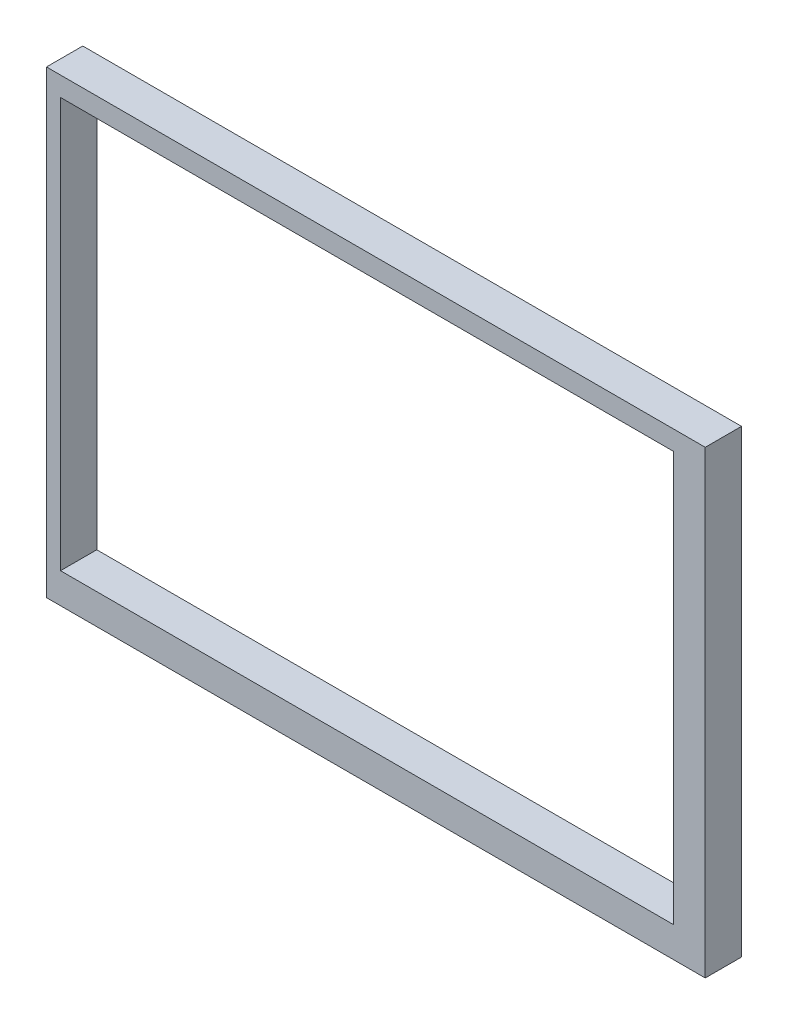
ISO-10303-21;
HEADER;
FILE_DESCRIPTION(('STEP AP214'),'2;1');
FILE_NAME('part.step','',(''),(''),'','','');
FILE_SCHEMA(('AUTOMOTIVE_DESIGN { 1 0 10303 214 1 1 1 1 }'));
ENDSEC;
DATA;
#1=APPLICATION_CONTEXT('core data for automotive mechanical design processes');
#2=APPLICATION_PROTOCOL_DEFINITION('international standard','automotive_design',2000,#1);
#3=PRODUCT_CONTEXT('',#1,'mechanical');
#4=PRODUCT('Part','Part','',(#3));
#5=PRODUCT_RELATED_PRODUCT_CATEGORY('part','',(#4));
#6=PRODUCT_DEFINITION_FORMATION('','',#4);
#7=PRODUCT_DEFINITION_CONTEXT('part definition',#1,'design');
#8=PRODUCT_DEFINITION('design','',#6,#7);
#9=PRODUCT_DEFINITION_SHAPE('','',#8);
#10=(LENGTH_UNIT() NAMED_UNIT(*) SI_UNIT(.MILLI.,.METRE.));
#11=(NAMED_UNIT(*) PLANE_ANGLE_UNIT() SI_UNIT($,.RADIAN.));
#12=(NAMED_UNIT(*) SI_UNIT($,.STERADIAN.) SOLID_ANGLE_UNIT());
#13=UNCERTAINTY_MEASURE_WITH_UNIT(LENGTH_MEASURE(1.E-05),#10,'distance_accuracy_value','');
#14=(GEOMETRIC_REPRESENTATION_CONTEXT(3) GLOBAL_UNCERTAINTY_ASSIGNED_CONTEXT((#13)) GLOBAL_UNIT_ASSIGNED_CONTEXT((#10,
#11,#12)) REPRESENTATION_CONTEXT('',''));
#15=CARTESIAN_POINT('',(0.,0.,0.));
#16=DIRECTION('',(0.,0.,1.));
#17=DIRECTION('',(1.,0.,0.));
#18=AXIS2_PLACEMENT_3D('',#15,#16,#17);
#19=CARTESIAN_POINT('',(0.,0.,5.));
#20=DIRECTION('',(0.,0.,1.));
#21=DIRECTION('',(1.,0.,0.));
#22=AXIS2_PLACEMENT_3D('',#19,#20,#21);
#23=PLANE('',#22);
#24=DIRECTION('',(0.,-1.,0.));
#25=VECTOR('',#24,1.);
#26=CARTESIAN_POINT('',(-48.6960708782743,35.6856702619415,5.));
#27=LINE('',#26,#25);
#28=CARTESIAN_POINT('',(-48.6960708782743,35.6856702619415,5.));
#29=VERTEX_POINT('',#28);
#30=CARTESIAN_POINT('',(-48.6960708782743,-27.6746451134954,5.));
#31=VERTEX_POINT('',#30);
#32=EDGE_CURVE('E143',#29,#31,#27,.T.);
#33=ORIENTED_EDGE('',*,*,#32,.T.);
#34=DIRECTION('',(1.,0.,0.));
#35=VECTOR('',#34,1.);
#36=CARTESIAN_POINT('',(-48.6960708782743,-27.6746451134954,5.));
#37=LINE('',#36,#35);
#38=CARTESIAN_POINT('',(42.1159253311023,-27.6746451134954,5.));
#39=VERTEX_POINT('',#38);
#40=EDGE_CURVE('E146',#31,#39,#37,.T.);
#41=ORIENTED_EDGE('',*,*,#40,.T.);
#42=DIRECTION('',(0.,1.,0.));
#43=VECTOR('',#42,1.);
#44=CARTESIAN_POINT('',(42.1159253311023,35.6856702619415,5.));
#45=LINE('',#44,#43);
#46=CARTESIAN_POINT('',(42.1159253311023,35.6856702619415,5.));
#47=VERTEX_POINT('',#46);
#48=EDGE_CURVE('E149',#39,#47,#45,.T.);
#49=ORIENTED_EDGE('',*,*,#48,.T.);
#50=DIRECTION('',(-1.,0.,0.));
#51=VECTOR('',#50,1.);
#52=CARTESIAN_POINT('',(-48.6960708782743,35.6856702619415,5.));
#53=LINE('',#52,#51);
#54=EDGE_CURVE('E151',#47,#29,#53,.T.);
#55=ORIENTED_EDGE('',*,*,#54,.T.);
#56=EDGE_LOOP('',(#33,#41,#49,#55));
#57=FACE_BOUND('',#56,.T.);
#58=DIRECTION('',(1.,0.,0.));
#59=VECTOR('',#58,1.);
#60=CARTESIAN_POINT('',(-46.7630970724191,-23.4907550077042,5.));
#61=LINE('',#60,#59);
#62=CARTESIAN_POINT('',(-46.7630970724191,-23.4907550077042,5.));
#63=VERTEX_POINT('',#62);
#64=CARTESIAN_POINT('',(37.7369029275809,-23.4907550077042,5.));
#65=VERTEX_POINT('',#64);
#66=EDGE_CURVE('E115',#63,#65,#61,.T.);
#67=ORIENTED_EDGE('',*,*,#66,.F.);
#68=DIRECTION('',(0.,-1.,0.));
#69=VECTOR('',#68,1.);
#70=CARTESIAN_POINT('',(-46.7630970724191,33.0092449922958,5.));
#71=LINE('',#70,#69);
#72=CARTESIAN_POINT('',(-46.7630970724191,33.0092449922958,5.));
#73=VERTEX_POINT('',#72);
#74=EDGE_CURVE('E107',#73,#63,#71,.T.);
#75=ORIENTED_EDGE('',*,*,#74,.F.);
#76=DIRECTION('',(-1.,0.,0.));
#77=VECTOR('',#76,1.);
#78=CARTESIAN_POINT('',(-46.7630970724191,33.0092449922958,5.));
#79=LINE('',#78,#77);
#80=CARTESIAN_POINT('',(37.7369029275809,33.0092449922958,5.));
#81=VERTEX_POINT('',#80);
#82=EDGE_CURVE('E129',#81,#73,#79,.T.);
#83=ORIENTED_EDGE('',*,*,#82,.F.);
#84=DIRECTION('',(0.,1.,0.));
#85=VECTOR('',#84,1.);
#86=CARTESIAN_POINT('',(37.7369029275809,33.0092449922958,5.));
#87=LINE('',#86,#85);
#88=EDGE_CURVE('E127',#65,#81,#87,.T.);
#89=ORIENTED_EDGE('',*,*,#88,.F.);
#90=EDGE_LOOP('',(#67,#75,#83,#89));
#91=FACE_BOUND('',#90,.T.);
#92=ADVANCED_FACE('F42',(#57,#91),#23,.T.);
#93=CARTESIAN_POINT('',(0.,0.,0.));
#94=DIRECTION('',(0.,0.,1.));
#95=DIRECTION('',(1.,0.,0.));
#96=AXIS2_PLACEMENT_3D('',#93,#94,#95);
#97=PLANE('',#96);
#98=DIRECTION('',(0.,-1.,0.));
#99=VECTOR('',#98,1.);
#100=CARTESIAN_POINT('',(-48.6960708782743,35.6856702619415,0.));
#101=LINE('',#100,#99);
#102=CARTESIAN_POINT('',(-48.6960708782743,35.6856702619415,0.));
#103=VERTEX_POINT('',#102);
#104=CARTESIAN_POINT('',(-48.6960708782743,-27.6746451134954,0.));
#105=VERTEX_POINT('',#104);
#106=EDGE_CURVE('E123',#103,#105,#101,.T.);
#107=ORIENTED_EDGE('',*,*,#106,.F.);
#108=DIRECTION('',(-1.,0.,0.));
#109=VECTOR('',#108,1.);
#110=CARTESIAN_POINT('',(-48.6960708782743,35.6856702619415,0.));
#111=LINE('',#110,#109);
#112=CARTESIAN_POINT('',(42.1159253311023,35.6856702619415,0.));
#113=VERTEX_POINT('',#112);
#114=EDGE_CURVE('E147',#113,#103,#111,.T.);
#115=ORIENTED_EDGE('',*,*,#114,.F.);
#116=DIRECTION('',(0.,1.,0.));
#117=VECTOR('',#116,1.);
#118=CARTESIAN_POINT('',(42.1159253311023,35.6856702619415,0.));
#119=LINE('',#118,#117);
#120=CARTESIAN_POINT('',(42.1159253311023,-27.6746451134954,0.));
#121=VERTEX_POINT('',#120);
#122=EDGE_CURVE('E158',#121,#113,#119,.T.);
#123=ORIENTED_EDGE('',*,*,#122,.F.);
#124=DIRECTION('',(1.,0.,0.));
#125=VECTOR('',#124,1.);
#126=CARTESIAN_POINT('',(-48.6960708782743,-27.6746451134954,0.));
#127=LINE('',#126,#125);
#128=EDGE_CURVE('E156',#105,#121,#127,.T.);
#129=ORIENTED_EDGE('',*,*,#128,.F.);
#130=EDGE_LOOP('',(#107,#115,#123,#129));
#131=FACE_BOUND('',#130,.T.);
#132=DIRECTION('',(0.,-1.,0.));
#133=VECTOR('',#132,1.);
#134=CARTESIAN_POINT('',(-46.7630970724191,33.0092449922958,0.));
#135=LINE('',#134,#133);
#136=CARTESIAN_POINT('',(-46.7630970724191,33.0092449922958,0.));
#137=VERTEX_POINT('',#136);
#138=CARTESIAN_POINT('',(-46.7630970724191,-23.4907550077042,0.));
#139=VERTEX_POINT('',#138);
#140=EDGE_CURVE('E65',#137,#139,#135,.T.);
#141=ORIENTED_EDGE('',*,*,#140,.T.);
#142=DIRECTION('',(1.,0.,0.));
#143=VECTOR('',#142,1.);
#144=CARTESIAN_POINT('',(-46.7630970724191,-23.4907550077042,0.));
#145=LINE('',#144,#143);
#146=CARTESIAN_POINT('',(37.7369029275809,-23.4907550077042,0.));
#147=VERTEX_POINT('',#146);
#148=EDGE_CURVE('E122',#139,#147,#145,.T.);
#149=ORIENTED_EDGE('',*,*,#148,.T.);
#150=DIRECTION('',(0.,1.,0.));
#151=VECTOR('',#150,1.);
#152=CARTESIAN_POINT('',(37.7369029275809,33.0092449922958,0.));
#153=LINE('',#152,#151);
#154=CARTESIAN_POINT('',(37.7369029275809,33.0092449922958,0.));
#155=VERTEX_POINT('',#154);
#156=EDGE_CURVE('E135',#147,#155,#153,.T.);
#157=ORIENTED_EDGE('',*,*,#156,.T.);
#158=DIRECTION('',(-1.,0.,0.));
#159=VECTOR('',#158,1.);
#160=CARTESIAN_POINT('',(-46.7630970724191,33.0092449922958,0.));
#161=LINE('',#160,#159);
#162=EDGE_CURVE('E116',#155,#137,#161,.T.);
#163=ORIENTED_EDGE('',*,*,#162,.T.);
#164=EDGE_LOOP('',(#141,#149,#157,#163));
#165=FACE_BOUND('',#164,.T.);
#166=ADVANCED_FACE('F176',(#131,#165),#97,.F.);
#167=CARTESIAN_POINT('',(-48.6960708782743,35.6856702619415,5.));
#168=DIRECTION('',(1.,0.,0.));
#169=DIRECTION('',(0.,0.,-1.));
#170=AXIS2_PLACEMENT_3D('',#167,#168,#169);
#171=PLANE('',#170);
#172=ORIENTED_EDGE('',*,*,#106,.T.);
#173=DIRECTION('',(0.,0.,-1.));
#174=VECTOR('',#173,1.);
#175=CARTESIAN_POINT('',(-48.6960708782743,-27.6746451134954,5.));
#176=LINE('',#175,#174);
#177=EDGE_CURVE('E11',#31,#105,#176,.T.);
#178=ORIENTED_EDGE('',*,*,#177,.F.);
#179=ORIENTED_EDGE('',*,*,#32,.F.);
#180=DIRECTION('',(0.,0.,-1.));
#181=VECTOR('',#180,1.);
#182=CARTESIAN_POINT('',(-48.6960708782743,35.6856702619415,5.));
#183=LINE('',#182,#181);
#184=EDGE_CURVE('E153',#29,#103,#183,.T.);
#185=ORIENTED_EDGE('',*,*,#184,.T.);
#186=EDGE_LOOP('',(#172,#178,#179,#185));
#187=FACE_BOUND('',#186,.T.);
#188=ADVANCED_FACE('F44',(#187),#171,.F.);
#189=CARTESIAN_POINT('',(-48.6960708782743,-27.6746451134954,5.));
#190=DIRECTION('',(0.,1.,0.));
#191=DIRECTION('',(0.,0.,1.));
#192=AXIS2_PLACEMENT_3D('',#189,#190,#191);
#193=PLANE('',#192);
#194=ORIENTED_EDGE('',*,*,#128,.T.);
#195=DIRECTION('',(0.,0.,-1.));
#196=VECTOR('',#195,1.);
#197=CARTESIAN_POINT('',(42.1159253311023,-27.6746451134954,5.));
#198=LINE('',#197,#196);
#199=EDGE_CURVE('E50',#39,#121,#198,.T.);
#200=ORIENTED_EDGE('',*,*,#199,.F.);
#201=ORIENTED_EDGE('',*,*,#40,.F.);
#202=ORIENTED_EDGE('',*,*,#177,.T.);
#203=EDGE_LOOP('',(#194,#200,#201,#202));
#204=FACE_BOUND('',#203,.T.);
#205=ADVANCED_FACE('F186',(#204),#193,.F.);
#206=CARTESIAN_POINT('',(42.1159253311023,35.6856702619415,5.));
#207=DIRECTION('',(-1.,0.,0.));
#208=DIRECTION('',(0.,-1.,0.));
#209=AXIS2_PLACEMENT_3D('',#206,#207,#208);
#210=PLANE('',#209);
#211=ORIENTED_EDGE('',*,*,#122,.T.);
#212=DIRECTION('',(0.,0.,-1.));
#213=VECTOR('',#212,1.);
#214=CARTESIAN_POINT('',(42.1159253311023,35.6856702619415,5.));
#215=LINE('',#214,#213);
#216=EDGE_CURVE('E163',#47,#113,#215,.T.);
#217=ORIENTED_EDGE('',*,*,#216,.F.);
#218=ORIENTED_EDGE('',*,*,#48,.F.);
#219=ORIENTED_EDGE('',*,*,#199,.T.);
#220=EDGE_LOOP('',(#211,#217,#218,#219));
#221=FACE_BOUND('',#220,.T.);
#222=ADVANCED_FACE('F170',(#221),#210,.F.);
#223=CARTESIAN_POINT('',(-48.6960708782743,35.6856702619415,5.));
#224=DIRECTION('',(0.,-1.,0.));
#225=DIRECTION('',(0.,0.,-1.));
#226=AXIS2_PLACEMENT_3D('',#223,#224,#225);
#227=PLANE('',#226);
#228=ORIENTED_EDGE('',*,*,#114,.T.);
#229=ORIENTED_EDGE('',*,*,#184,.F.);
#230=ORIENTED_EDGE('',*,*,#54,.F.);
#231=ORIENTED_EDGE('',*,*,#216,.T.);
#232=EDGE_LOOP('',(#228,#229,#230,#231));
#233=FACE_BOUND('',#232,.T.);
#234=ADVANCED_FACE('F180',(#233),#227,.F.);
#235=CARTESIAN_POINT('',(-46.7630970724191,33.0092449922958,5.));
#236=DIRECTION('',(1.,0.,0.));
#237=DIRECTION('',(0.,0.,-1.));
#238=AXIS2_PLACEMENT_3D('',#235,#236,#237);
#239=PLANE('',#238);
#240=ORIENTED_EDGE('',*,*,#140,.F.);
#241=DIRECTION('',(0.,0.,-1.));
#242=VECTOR('',#241,1.);
#243=CARTESIAN_POINT('',(-46.7630970724191,33.0092449922958,5.));
#244=LINE('',#243,#242);
#245=EDGE_CURVE('E111',#73,#137,#244,.T.);
#246=ORIENTED_EDGE('',*,*,#245,.F.);
#247=ORIENTED_EDGE('',*,*,#74,.T.);
#248=DIRECTION('',(0.,0.,-1.));
#249=VECTOR('',#248,1.);
#250=CARTESIAN_POINT('',(-46.7630970724191,-23.4907550077042,5.));
#251=LINE('',#250,#249);
#252=EDGE_CURVE('E110',#63,#139,#251,.T.);
#253=ORIENTED_EDGE('',*,*,#252,.T.);
#254=EDGE_LOOP('',(#240,#246,#247,#253));
#255=FACE_BOUND('',#254,.T.);
#256=ADVANCED_FACE('F109',(#255),#239,.T.);
#257=CARTESIAN_POINT('',(-46.7630970724191,-23.4907550077042,5.));
#258=DIRECTION('',(0.,1.,0.));
#259=DIRECTION('',(0.,0.,1.));
#260=AXIS2_PLACEMENT_3D('',#257,#258,#259);
#261=PLANE('',#260);
#262=ORIENTED_EDGE('',*,*,#148,.F.);
#263=ORIENTED_EDGE('',*,*,#252,.F.);
#264=ORIENTED_EDGE('',*,*,#66,.T.);
#265=DIRECTION('',(0.,0.,-1.));
#266=VECTOR('',#265,1.);
#267=CARTESIAN_POINT('',(37.7369029275809,-23.4907550077042,5.));
#268=LINE('',#267,#266);
#269=EDGE_CURVE('E124',#65,#147,#268,.T.);
#270=ORIENTED_EDGE('',*,*,#269,.T.);
#271=EDGE_LOOP('',(#262,#263,#264,#270));
#272=FACE_BOUND('',#271,.T.);
#273=ADVANCED_FACE('F119',(#272),#261,.T.);
#274=CARTESIAN_POINT('',(37.7369029275809,33.0092449922958,5.));
#275=DIRECTION('',(-1.,0.,0.));
#276=DIRECTION('',(0.,-1.,0.));
#277=AXIS2_PLACEMENT_3D('',#274,#275,#276);
#278=PLANE('',#277);
#279=ORIENTED_EDGE('',*,*,#156,.F.);
#280=ORIENTED_EDGE('',*,*,#269,.F.);
#281=ORIENTED_EDGE('',*,*,#88,.T.);
#282=DIRECTION('',(0.,0.,-1.));
#283=VECTOR('',#282,1.);
#284=CARTESIAN_POINT('',(37.7369029275809,33.0092449922958,5.));
#285=LINE('',#284,#283);
#286=EDGE_CURVE('E57',#81,#155,#285,.T.);
#287=ORIENTED_EDGE('',*,*,#286,.T.);
#288=EDGE_LOOP('',(#279,#280,#281,#287));
#289=FACE_BOUND('',#288,.T.);
#290=ADVANCED_FACE('F209',(#289),#278,.T.);
#291=CARTESIAN_POINT('',(-46.7630970724191,33.0092449922958,5.));
#292=DIRECTION('',(0.,-1.,0.));
#293=DIRECTION('',(0.,0.,-1.));
#294=AXIS2_PLACEMENT_3D('',#291,#292,#293);
#295=PLANE('',#294);
#296=ORIENTED_EDGE('',*,*,#162,.F.);
#297=ORIENTED_EDGE('',*,*,#286,.F.);
#298=ORIENTED_EDGE('',*,*,#82,.T.);
#299=ORIENTED_EDGE('',*,*,#245,.T.);
#300=EDGE_LOOP('',(#296,#297,#298,#299));
#301=FACE_BOUND('',#300,.T.);
#302=ADVANCED_FACE('F213',(#301),#295,.T.);
#303=CLOSED_SHELL('',(#92,#166,#188,#205,#222,#234,#256,#273,#290,#302));
#304=MANIFOLD_SOLID_BREP('B2',#303);
#305=ADVANCED_BREP_SHAPE_REPRESENTATION('',(#18,#304),#14);
#306=SHAPE_DEFINITION_REPRESENTATION(#9,#305);
ENDSEC;
END-ISO-10303-21;
